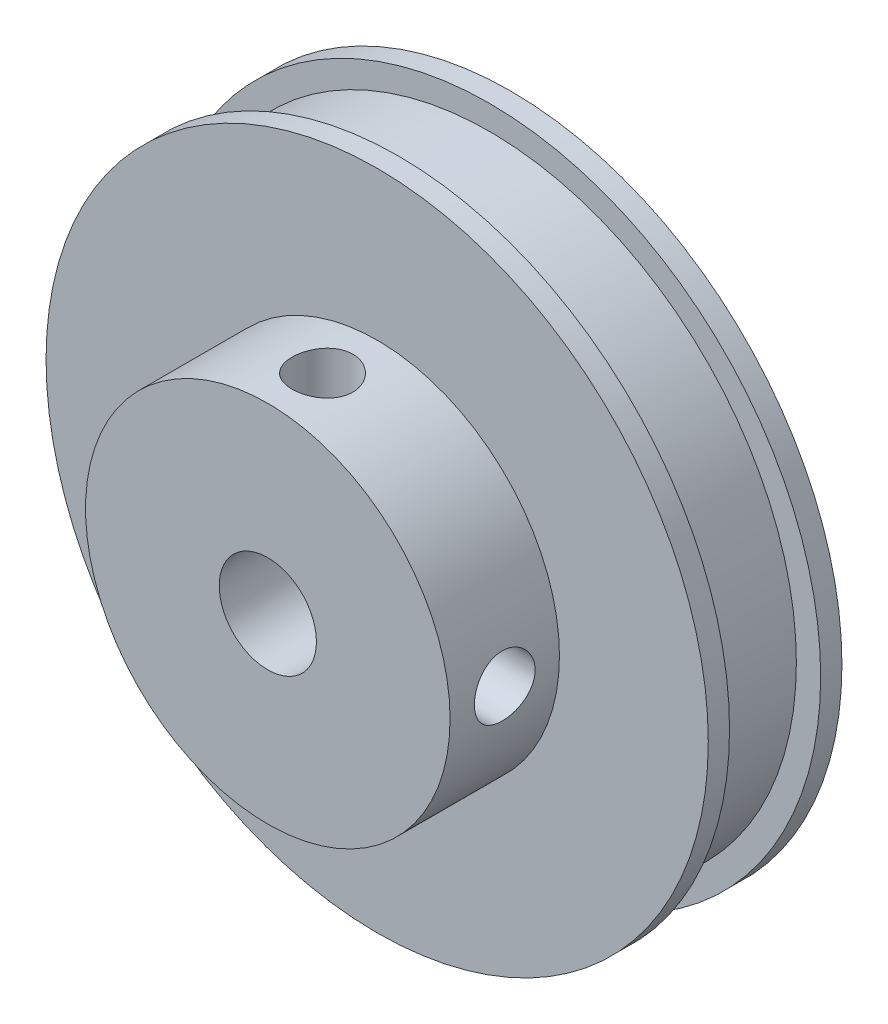
ISO-10303-21;
HEADER;
FILE_DESCRIPTION(('STEP AP214'),'2;1');
FILE_NAME('part.step','',(''),(''),'','','');
FILE_SCHEMA(('AUTOMOTIVE_DESIGN { 1 0 10303 214 1 1 1 1 }'));
ENDSEC;
DATA;
#1=APPLICATION_CONTEXT('core data for automotive mechanical design processes');
#2=APPLICATION_PROTOCOL_DEFINITION('international standard','automotive_design',2000,#1);
#3=PRODUCT_CONTEXT('',#1,'mechanical');
#4=PRODUCT('Part','Part','',(#3));
#5=PRODUCT_RELATED_PRODUCT_CATEGORY('part','',(#4));
#6=PRODUCT_DEFINITION_FORMATION('','',#4);
#7=PRODUCT_DEFINITION_CONTEXT('part definition',#1,'design');
#8=PRODUCT_DEFINITION('design','',#6,#7);
#9=PRODUCT_DEFINITION_SHAPE('','',#8);
#10=(LENGTH_UNIT() NAMED_UNIT(*) SI_UNIT(.MILLI.,.METRE.));
#11=(NAMED_UNIT(*) PLANE_ANGLE_UNIT() SI_UNIT($,.RADIAN.));
#12=(NAMED_UNIT(*) SI_UNIT($,.STERADIAN.) SOLID_ANGLE_UNIT());
#13=UNCERTAINTY_MEASURE_WITH_UNIT(LENGTH_MEASURE(1.E-05),#10,'distance_accuracy_value','');
#14=(GEOMETRIC_REPRESENTATION_CONTEXT(3) GLOBAL_UNCERTAINTY_ASSIGNED_CONTEXT((#13)) GLOBAL_UNIT_ASSIGNED_CONTEXT((#10,
#11,#12)) REPRESENTATION_CONTEXT('',''));
#15=CARTESIAN_POINT('',(0.,0.,0.));
#16=DIRECTION('',(0.,0.,1.));
#17=DIRECTION('',(1.,0.,0.));
#18=AXIS2_PLACEMENT_3D('',#15,#16,#17);
#19=CARTESIAN_POINT('',(0.,0.,1.75));
#20=DIRECTION('',(0.,0.,-1.));
#21=DIRECTION('',(-1.,0.,0.));
#22=AXIS2_PLACEMENT_3D('',#19,#20,#21);
#23=CYLINDRICAL_SURFACE('',#22,27.25);
#24=CARTESIAN_POINT('',(0.,0.,1.75));
#25=DIRECTION('',(0.,0.,1.));
#26=DIRECTION('',(1.,0.,0.));
#27=AXIS2_PLACEMENT_3D('',#24,#25,#26);
#28=CIRCLE('',#27,27.25);
#29=CARTESIAN_POINT('',(27.25,0.,1.75));
#30=VERTEX_POINT('',#29);
#31=EDGE_CURVE('E51',#30,#30,#28,.T.);
#32=ORIENTED_EDGE('',*,*,#31,.F.);
#33=EDGE_LOOP('',(#32));
#34=FACE_BOUND('',#33,.T.);
#35=CARTESIAN_POINT('',(0.,0.,0.));
#36=DIRECTION('',(0.,0.,1.));
#37=DIRECTION('',(1.,0.,0.));
#38=AXIS2_PLACEMENT_3D('',#35,#36,#37);
#39=CIRCLE('',#38,27.25);
#40=CARTESIAN_POINT('',(27.25,0.,0.));
#41=VERTEX_POINT('',#40);
#42=EDGE_CURVE('E65',#41,#41,#39,.T.);
#43=ORIENTED_EDGE('',*,*,#42,.T.);
#44=EDGE_LOOP('',(#43));
#45=FACE_BOUND('',#44,.T.);
#46=ADVANCED_FACE('F34',(#34,#45),#23,.T.);
#47=CARTESIAN_POINT('',(0.,0.,1.75));
#48=DIRECTION('',(0.,0.,1.));
#49=DIRECTION('',(1.,0.,0.));
#50=AXIS2_PLACEMENT_3D('',#47,#48,#49);
#51=PLANE('',#50);
#52=CARTESIAN_POINT('',(0.,0.,1.75));
#53=DIRECTION('',(0.,0.,1.));
#54=DIRECTION('',(1.,0.,0.));
#55=AXIS2_PLACEMENT_3D('',#52,#53,#54);
#56=CIRCLE('',#55,25.25);
#57=CARTESIAN_POINT('',(25.25,0.,1.75));
#58=VERTEX_POINT('',#57);
#59=EDGE_CURVE('E46',#58,#58,#56,.T.);
#60=ORIENTED_EDGE('',*,*,#59,.F.);
#61=EDGE_LOOP('',(#60));
#62=FACE_BOUND('',#61,.T.);
#63=ORIENTED_EDGE('',*,*,#31,.T.);
#64=EDGE_LOOP('',(#63));
#65=FACE_BOUND('',#64,.T.);
#66=ADVANCED_FACE('F129',(#62,#65),#51,.T.);
#67=CARTESIAN_POINT('',(0.,0.,0.));
#68=DIRECTION('',(0.,0.,1.));
#69=DIRECTION('',(1.,0.,0.));
#70=AXIS2_PLACEMENT_3D('',#67,#68,#69);
#71=PLANE('',#70);
#72=CARTESIAN_POINT('',(0.,0.,0.));
#73=DIRECTION('',(0.,0.,1.));
#74=DIRECTION('',(1.,0.,0.));
#75=AXIS2_PLACEMENT_3D('',#72,#73,#74);
#76=CIRCLE('',#75,4.);
#77=CARTESIAN_POINT('',(4.,0.,0.));
#78=VERTEX_POINT('',#77);
#79=EDGE_CURVE('E103',#78,#78,#76,.F.);
#80=ORIENTED_EDGE('',*,*,#79,.F.);
#81=EDGE_LOOP('',(#80));
#82=FACE_BOUND('',#81,.T.);
#83=ORIENTED_EDGE('',*,*,#42,.F.);
#84=EDGE_LOOP('',(#83));
#85=FACE_BOUND('',#84,.T.);
#86=ADVANCED_FACE('F134',(#82,#85),#71,.F.);
#87=CARTESIAN_POINT('',(0.,0.,9.25));
#88=DIRECTION('',(0.,0.,-1.));
#89=DIRECTION('',(-1.,0.,0.));
#90=AXIS2_PLACEMENT_3D('',#87,#88,#89);
#91=CYLINDRICAL_SURFACE('',#90,25.25);
#92=CARTESIAN_POINT('',(0.,0.,9.25));
#93=DIRECTION('',(0.,0.,1.));
#94=DIRECTION('',(1.,0.,0.));
#95=AXIS2_PLACEMENT_3D('',#92,#93,#94);
#96=CIRCLE('',#95,25.25);
#97=CARTESIAN_POINT('',(25.25,0.,9.25));
#98=VERTEX_POINT('',#97);
#99=EDGE_CURVE('E60',#98,#98,#96,.T.);
#100=ORIENTED_EDGE('',*,*,#99,.F.);
#101=EDGE_LOOP('',(#100));
#102=FACE_BOUND('',#101,.T.);
#103=ORIENTED_EDGE('',*,*,#59,.T.);
#104=EDGE_LOOP('',(#103));
#105=FACE_BOUND('',#104,.T.);
#106=ADVANCED_FACE('F142',(#102,#105),#91,.T.);
#107=CARTESIAN_POINT('',(0.,0.,11.));
#108=DIRECTION('',(0.,0.,-1.));
#109=DIRECTION('',(-1.,0.,0.));
#110=AXIS2_PLACEMENT_3D('',#107,#108,#109);
#111=CYLINDRICAL_SURFACE('',#110,27.25);
#112=CARTESIAN_POINT('',(0.,0.,11.));
#113=DIRECTION('',(0.,0.,1.));
#114=DIRECTION('',(1.,0.,0.));
#115=AXIS2_PLACEMENT_3D('',#112,#113,#114);
#116=CIRCLE('',#115,27.25);
#117=CARTESIAN_POINT('',(27.25,0.,11.));
#118=VERTEX_POINT('',#117);
#119=EDGE_CURVE('E57',#118,#118,#116,.T.);
#120=ORIENTED_EDGE('',*,*,#119,.F.);
#121=EDGE_LOOP('',(#120));
#122=FACE_BOUND('',#121,.T.);
#123=CARTESIAN_POINT('',(0.,0.,9.25));
#124=DIRECTION('',(0.,0.,1.));
#125=DIRECTION('',(1.,0.,0.));
#126=AXIS2_PLACEMENT_3D('',#123,#124,#125);
#127=CIRCLE('',#126,27.25);
#128=CARTESIAN_POINT('',(27.25,0.,9.25));
#129=VERTEX_POINT('',#128);
#130=EDGE_CURVE('E61',#129,#129,#127,.T.);
#131=ORIENTED_EDGE('',*,*,#130,.T.);
#132=EDGE_LOOP('',(#131));
#133=FACE_BOUND('',#132,.T.);
#134=ADVANCED_FACE('F147',(#122,#133),#111,.T.);
#135=CARTESIAN_POINT('',(0.,0.,11.));
#136=DIRECTION('',(0.,0.,1.));
#137=DIRECTION('',(1.,0.,0.));
#138=AXIS2_PLACEMENT_3D('',#135,#136,#137);
#139=PLANE('',#138);
#140=CARTESIAN_POINT('',(0.,0.,11.));
#141=DIRECTION('',(0.,0.,1.));
#142=DIRECTION('',(1.,0.,0.));
#143=AXIS2_PLACEMENT_3D('',#140,#141,#142);
#144=CIRCLE('',#143,15.);
#145=CARTESIAN_POINT('',(15.,0.,11.));
#146=VERTEX_POINT('',#145);
#147=EDGE_CURVE('E10',#146,#146,#144,.T.);
#148=ORIENTED_EDGE('',*,*,#147,.F.);
#149=EDGE_LOOP('',(#148));
#150=FACE_BOUND('',#149,.T.);
#151=ORIENTED_EDGE('',*,*,#119,.T.);
#152=EDGE_LOOP('',(#151));
#153=FACE_BOUND('',#152,.T.);
#154=ADVANCED_FACE('F122',(#150,#153),#139,.T.);
#155=CARTESIAN_POINT('',(0.,0.,9.25));
#156=DIRECTION('',(0.,0.,1.));
#157=DIRECTION('',(1.,0.,0.));
#158=AXIS2_PLACEMENT_3D('',#155,#156,#157);
#159=PLANE('',#158);
#160=ORIENTED_EDGE('',*,*,#99,.T.);
#161=EDGE_LOOP('',(#160));
#162=FACE_BOUND('',#161,.T.);
#163=ORIENTED_EDGE('',*,*,#130,.F.);
#164=EDGE_LOOP('',(#163));
#165=FACE_BOUND('',#164,.T.);
#166=ADVANCED_FACE('F114',(#162,#165),#159,.F.);
#167=CARTESIAN_POINT('',(0.,0.,20.));
#168=DIRECTION('',(0.,0.,-1.));
#169=DIRECTION('',(-1.,0.,0.));
#170=AXIS2_PLACEMENT_3D('',#167,#168,#169);
#171=CYLINDRICAL_SURFACE('',#170,15.);
#172=CARTESIAN_POINT('',(0.,15.,13.));
#173=CARTESIAN_POINT('',(-0.139390904958215,14.9999976116882,13.0000055889478));
#174=CARTESIAN_POINT('',(-0.278857881838821,14.9980367791303,13.0116972749689));
#175=CARTESIAN_POINT('',(-0.553880221673042,14.9904034494139,13.0581356587653));
#176=CARTESIAN_POINT('',(-0.689431867959246,14.9847275392389,13.0929035569116));
#177=CARTESIAN_POINT('',(-0.952604747212643,14.9703006823645,13.1844154485928));
#178=CARTESIAN_POINT('',(-1.0802323684319,14.9615522515919,13.2411414656406));
#179=CARTESIAN_POINT('',(-1.32414184197794,14.9419422708207,13.3749122920524));
#180=CARTESIAN_POINT('',(-1.44042498987859,14.9310809625443,13.451954777483));
#181=CARTESIAN_POINT('',(-1.65947261429168,14.9083331745831,13.6249550838205));
#182=CARTESIAN_POINT('',(-1.76211290353497,14.8964387181486,13.7210691146361));
#183=CARTESIAN_POINT('',(-1.94988849865993,14.8730262687673,13.9291479684728));
#184=CARTESIAN_POINT('',(-2.03502269939097,14.8615082996267,14.0411137914566));
#185=CARTESIAN_POINT('',(-2.18586712560513,14.8400756575978,14.2785709661971));
#186=CARTESIAN_POINT('',(-2.251454552861,14.8301712909164,14.4041413368048));
#187=CARTESIAN_POINT('',(-2.36055836541122,14.8131978979467,14.6647095643006));
#188=CARTESIAN_POINT('',(-2.40407624156561,14.8061286801431,14.7997067836776));
#189=CARTESIAN_POINT('',(-2.46741437778481,14.7957053684276,15.0739802748565));
#190=CARTESIAN_POINT('',(-2.4874490291354,14.792317684857,15.2132057365014));
#191=CARTESIAN_POINT('',(-2.50391672528987,14.7895393893665,15.4930802768835));
#192=CARTESIAN_POINT('',(-2.500351440389,14.7901484945721,15.6337292541673));
#193=CARTESIAN_POINT('',(-2.46989509839615,14.7952642886355,15.9109278612754));
#194=CARTESIAN_POINT('',(-2.44324488188977,14.7997307331892,16.0475048035452));
#195=CARTESIAN_POINT('',(-2.36775314040344,14.8119949521101,16.3142213178291));
#196=CARTESIAN_POINT('',(-2.31891085431974,14.8197928407327,16.4443606688885));
#197=CARTESIAN_POINT('',(-2.20017724609391,14.837884793341,16.6952288234409));
#198=CARTESIAN_POINT('',(-2.13018591387971,14.8481906710733,16.8159094060812));
#199=CARTESIAN_POINT('',(-1.97121201755743,14.8701291841501,17.0439044005384));
#200=CARTESIAN_POINT('',(-1.88222792065429,14.8817619265429,17.1512177324549));
#201=CARTESIAN_POINT('',(-1.68648221215905,14.9052202787979,17.3508260858073));
#202=CARTESIAN_POINT('',(-1.57951396387313,14.9170464923165,17.4429185185401));
#203=CARTESIAN_POINT('',(-1.35153524898165,14.9394260139672,17.6078777626653));
#204=CARTESIAN_POINT('',(-1.23052469190642,14.9499793138975,17.6807444501832));
#205=CARTESIAN_POINT('',(-0.977705916166712,14.9686389289291,17.8052022271363));
#206=CARTESIAN_POINT('',(-0.845888725564663,14.9767431840745,17.8567754193313));
#207=CARTESIAN_POINT('',(-0.575298345602733,14.9895750301266,17.936994215246));
#208=CARTESIAN_POINT('',(-0.436525739179469,14.9943029035047,17.9656417369737));
#209=CARTESIAN_POINT('',(-0.157709901301623,14.9998112984269,17.9989213584611));
#210=CARTESIAN_POINT('',(-0.0177007371510108,15.0006375301278,18.0038315718056));
#211=CARTESIAN_POINT('',(0.261139772889887,14.9983747442117,17.9902386555719));
#212=CARTESIAN_POINT('',(0.399971163892038,14.9952858772412,17.9717364268663));
#213=CARTESIAN_POINT('',(0.671656175546762,14.985568269382,17.9120751506645));
#214=CARTESIAN_POINT('',(0.804540868385379,14.9789610480131,17.8710537916099));
#215=CARTESIAN_POINT('',(1.06154688486044,14.9629446445536,17.7676654818005));
#216=CARTESIAN_POINT('',(1.18566771590972,14.9535353051202,17.7052973323647));
#217=CARTESIAN_POINT('',(1.42283068946896,14.9328451630241,17.5603488753032));
#218=CARTESIAN_POINT('',(1.53576525093715,14.9215485588702,17.4775948438327));
#219=CARTESIAN_POINT('',(1.74624358550269,14.898384673919,17.2944626846149));
#220=CARTESIAN_POINT('',(1.84378623969658,14.8865173517155,17.1940832767233));
#221=CARTESIAN_POINT('',(2.021742779658,14.8634017523585,16.9773024519286));
#222=CARTESIAN_POINT('',(2.10196876111371,14.8521611613711,16.8607458344856));
#223=CARTESIAN_POINT('',(2.24170231029498,14.8317152977788,16.6156470308615));
#224=CARTESIAN_POINT('',(2.30121053476982,14.8225099606602,16.4871052247725));
#225=CARTESIAN_POINT('',(2.39753833147315,14.807234536977,16.2222102671879));
#226=CARTESIAN_POINT('',(2.43445143254794,14.8011515431106,16.0858919049695));
#227=CARTESIAN_POINT('',(2.48483545377828,14.7927771683526,15.8088798707782));
#228=CARTESIAN_POINT('',(2.49830841194617,14.7904854578272,15.6681865802679));
#229=CARTESIAN_POINT('',(2.50137286604735,14.7899673308401,15.3882948340376));
#230=CARTESIAN_POINT('',(2.49126013612519,14.7916905650565,15.2490996214247));
#231=CARTESIAN_POINT('',(2.44807983895685,14.7988978145373,14.9744207519492));
#232=CARTESIAN_POINT('',(2.41501234611248,14.8043818176121,14.8389370830581));
#233=CARTESIAN_POINT('',(2.3269744895949,14.8184735628172,14.5756415627074));
#234=CARTESIAN_POINT('',(2.27202959060044,14.8270776721967,14.447820989944));
#235=CARTESIAN_POINT('',(2.14182700391591,14.8464436892221,14.2031643308052));
#236=CARTESIAN_POINT('',(2.06656830874856,14.857205703884,14.0863287896279));
#237=CARTESIAN_POINT('',(1.89681888437215,14.8798345404562,13.8654644168922));
#238=CARTESIAN_POINT('',(1.80211056359365,14.891712955763,13.7616039832997));
#239=CARTESIAN_POINT('',(1.59660903138023,14.9151437236084,13.5711483955251));
#240=CARTESIAN_POINT('',(1.48581211291264,14.9266960002655,13.4845572313618));
#241=CARTESIAN_POINT('',(1.25036916964028,14.9482652964222,13.3305517318001));
#242=CARTESIAN_POINT('',(1.12563278753282,14.958271162531,13.263273960687));
#243=CARTESIAN_POINT('',(0.866513069378982,14.9755116760178,13.1507305153901));
#244=CARTESIAN_POINT('',(0.73213949483001,14.9827490817748,13.1054429189203));
#245=CARTESIAN_POINT('',(0.497703310045401,14.9920579083296,13.0479947258733));
#246=CARTESIAN_POINT('',(0.399058830298448,14.9950202727336,13.030025530384));
#247=CARTESIAN_POINT('',(0.200289310319809,14.9989921598612,13.0060262621552));
#248=CARTESIAN_POINT('',(0.100164295608494,15.0000017162064,12.9999959838626));
#249=CARTESIAN_POINT('',(0.,15.,13.));
#250=B_SPLINE_CURVE_WITH_KNOTS('',3,(#172,#173,#174,#175,#176,#177,#178,#179,#180,#181,#182,
#183,#184,#185,#186,#187,#188,#189,#190,#191,#192,#193,#194,#195,#196,#197,#198,#199,#200,#201,
#202,#203,#204,#205,#206,#207,#208,#209,#210,#211,#212,#213,#214,#215,#216,#217,#218,#219,#220,
#221,#222,#223,#224,#225,#226,#227,#228,#229,#230,#231,#232,#233,#234,#235,#236,#237,#238,#239,
#240,#241,#242,#243,#244,#245,#246,#247,#248,#249),.UNSPECIFIED.,.T.,.F.,(4,2,2,2,2,2,2,2,2,2,2,
2,2,2,2,2,2,2,2,2,2,2,2,2,2,2,2,2,2,2,2,2,2,2,2,2,2,2,4),(0.,0.417806584938509,0.83599754569542,
1.25384686702527,1.67164841267479,2.09302491062332,2.51442800169857,2.9384252082384,
3.36239376876181,3.78246077103423,4.20249804320887,4.61820521760409,5.03392665025381,
5.45164556632557,5.86939820680573,6.29232769911326,6.71525991635847,7.13854688915903,
7.56179844521148,7.98007883491397,8.39834313035859,8.81407807006415,9.22983635826066,
9.64926825627023,10.0687306305428,10.4925382200762,10.9163323737594,11.3383602234177,
11.7603513778662,12.177079095227,12.5938054618813,13.0100481822622,13.4263115502934,
13.8475138419339,14.2688133387897,14.693022316072,15.1168075213007,15.4170424816402,
15.7172722727697),.UNSPECIFIED.);
#251=CARTESIAN_POINT('',(0.,15.,13.));
#252=VERTEX_POINT('',#251);
#253=EDGE_CURVE('E98',#252,#252,#250,.T.);
#254=ORIENTED_EDGE('',*,*,#253,.F.);
#255=EDGE_LOOP('',(#254));
#256=FACE_BOUND('',#255,.T.);
#257=CARTESIAN_POINT('',(15.,0.,18.));
#258=CARTESIAN_POINT('',(14.9999976116882,-0.139390904958215,17.9999944110522));
#259=CARTESIAN_POINT('',(14.9980367791303,-0.278857881838821,17.9883027250311));
#260=CARTESIAN_POINT('',(14.9904034494139,-0.553880221673043,17.9418643412347));
#261=CARTESIAN_POINT('',(14.9847275392389,-0.689431867959247,17.9070964430884));
#262=CARTESIAN_POINT('',(14.9703006823645,-0.952604747212644,17.8155845514072));
#263=CARTESIAN_POINT('',(14.9615522515919,-1.0802323684319,17.7588585343594));
#264=CARTESIAN_POINT('',(14.9419422708207,-1.32414184197794,17.6250877079476));
#265=CARTESIAN_POINT('',(14.9310809625443,-1.44042498987859,17.548045222517));
#266=CARTESIAN_POINT('',(14.9083331745831,-1.65947261429168,17.3750449161795));
#267=CARTESIAN_POINT('',(14.8964387181486,-1.76211290353497,17.2789308853639));
#268=CARTESIAN_POINT('',(14.8730262687673,-1.94988849865993,17.0708520315272));
#269=CARTESIAN_POINT('',(14.8615082996267,-2.03502269939097,16.9588862085434));
#270=CARTESIAN_POINT('',(14.8400756575978,-2.18586712560513,16.7214290338029));
#271=CARTESIAN_POINT('',(14.8301712909164,-2.251454552861,16.5958586631952));
#272=CARTESIAN_POINT('',(14.8131978979467,-2.36055836541122,16.3352904356994));
#273=CARTESIAN_POINT('',(14.8061286801431,-2.40407624156561,16.2002932163224));
#274=CARTESIAN_POINT('',(14.7957053684276,-2.46741437778481,15.9260197251435));
#275=CARTESIAN_POINT('',(14.792317684857,-2.4874490291354,15.7867942634986));
#276=CARTESIAN_POINT('',(14.7895393893665,-2.50391672528987,15.5069197231165));
#277=CARTESIAN_POINT('',(14.7901484945721,-2.500351440389,15.3662707458327));
#278=CARTESIAN_POINT('',(14.7952642886355,-2.46989509839615,15.0890721387245));
#279=CARTESIAN_POINT('',(14.7997307331892,-2.44324488188977,14.9524951964548));
#280=CARTESIAN_POINT('',(14.8119949521101,-2.36775314040344,14.6857786821709));
#281=CARTESIAN_POINT('',(14.8197928407327,-2.31891085431974,14.5556393311114));
#282=CARTESIAN_POINT('',(14.837884793341,-2.20017724609391,14.3047711765591));
#283=CARTESIAN_POINT('',(14.8481906710733,-2.13018591387971,14.1840905939188));
#284=CARTESIAN_POINT('',(14.8701291841501,-1.97121201755743,13.9560955994616));
#285=CARTESIAN_POINT('',(14.8817619265429,-1.88222792065429,13.8487822675451));
#286=CARTESIAN_POINT('',(14.9052202787979,-1.68648221215905,13.6491739141927));
#287=CARTESIAN_POINT('',(14.9170464923165,-1.57951396387313,13.5570814814599));
#288=CARTESIAN_POINT('',(14.9394260139672,-1.35153524898165,13.3921222373347));
#289=CARTESIAN_POINT('',(14.9499793138975,-1.23052469190642,13.3192555498168));
#290=CARTESIAN_POINT('',(14.9686389289291,-0.977705916166711,13.1947977728637));
#291=CARTESIAN_POINT('',(14.9767431840745,-0.845888725564661,13.1432245806687));
#292=CARTESIAN_POINT('',(14.9895750301266,-0.575298345602731,13.063005784754));
#293=CARTESIAN_POINT('',(14.9943029035047,-0.436525739179468,13.0343582630263));
#294=CARTESIAN_POINT('',(14.9998112984269,-0.157709901301624,13.0010786415389));
#295=CARTESIAN_POINT('',(15.0006375301278,-0.017700737151011,12.9961684281944));
#296=CARTESIAN_POINT('',(14.9983747442117,0.261139772889887,13.0097613444281));
#297=CARTESIAN_POINT('',(14.9952858772412,0.399971163892038,13.0282635731337));
#298=CARTESIAN_POINT('',(14.985568269382,0.671656175546762,13.0879248493355));
#299=CARTESIAN_POINT('',(14.9789610480131,0.804540868385378,13.1289462083901));
#300=CARTESIAN_POINT('',(14.9629446445536,1.06154688486044,13.2323345181995));
#301=CARTESIAN_POINT('',(14.9535353051202,1.18566771590972,13.2947026676353));
#302=CARTESIAN_POINT('',(14.9328451630241,1.42283068946896,13.4396511246968));
#303=CARTESIAN_POINT('',(14.9215485588702,1.53576525093715,13.5224051561673));
#304=CARTESIAN_POINT('',(14.898384673919,1.74624358550269,13.7055373153851));
#305=CARTESIAN_POINT('',(14.8865173517155,1.84378623969658,13.8059167232767));
#306=CARTESIAN_POINT('',(14.8634017523585,2.021742779658,14.0226975480714));
#307=CARTESIAN_POINT('',(14.8521611613711,2.10196876111371,14.1392541655144));
#308=CARTESIAN_POINT('',(14.8317152977788,2.24170231029498,14.3843529691385));
#309=CARTESIAN_POINT('',(14.8225099606602,2.30121053476982,14.5128947752275));
#310=CARTESIAN_POINT('',(14.807234536977,2.39753833147315,14.7777897328121));
#311=CARTESIAN_POINT('',(14.8011515431106,2.43445143254794,14.9141080950305));
#312=CARTESIAN_POINT('',(14.7927771683526,2.48483545377828,15.1911201292218));
#313=CARTESIAN_POINT('',(14.7904854578272,2.49830841194617,15.331813419732));
#314=CARTESIAN_POINT('',(14.7899673308401,2.50137286604735,15.6117051659624));
#315=CARTESIAN_POINT('',(14.7916905650565,2.49126013612519,15.7509003785753));
#316=CARTESIAN_POINT('',(14.7988978145373,2.44807983895685,16.0255792480508));
#317=CARTESIAN_POINT('',(14.8043818176121,2.41501234611248,16.1610629169419));
#318=CARTESIAN_POINT('',(14.8184735628172,2.3269744895949,16.4243584372926));
#319=CARTESIAN_POINT('',(14.8270776721967,2.27202959060044,16.552179010056));
#320=CARTESIAN_POINT('',(14.8464436892221,2.14182700391591,16.7968356691948));
#321=CARTESIAN_POINT('',(14.857205703884,2.06656830874856,16.9136712103721));
#322=CARTESIAN_POINT('',(14.8798345404562,1.89681888437216,17.1345355831077));
#323=CARTESIAN_POINT('',(14.891712955763,1.80211056359365,17.2383960167003));
#324=CARTESIAN_POINT('',(14.9151437236084,1.59660903138023,17.4288516044749));
#325=CARTESIAN_POINT('',(14.9266960002655,1.48581211291264,17.5154427686382));
#326=CARTESIAN_POINT('',(14.9482652964222,1.25036916964028,17.6694482681999));
#327=CARTESIAN_POINT('',(14.958271162531,1.12563278753282,17.7367260393129));
#328=CARTESIAN_POINT('',(14.9755116760178,0.866513069378982,17.8492694846099));
#329=CARTESIAN_POINT('',(14.9827490817748,0.732139494830011,17.8945570810797));
#330=CARTESIAN_POINT('',(14.9920579083296,0.497703310045402,17.9520052741267));
#331=CARTESIAN_POINT('',(14.9950202727336,0.399058830298448,17.969974469616));
#332=CARTESIAN_POINT('',(14.9989921598612,0.20028931031981,17.9939737378448));
#333=CARTESIAN_POINT('',(15.0000017162064,0.100164295608494,18.0000040161374));
#334=CARTESIAN_POINT('',(15.,0.,18.));
#335=B_SPLINE_CURVE_WITH_KNOTS('',3,(#257,#258,#259,#260,#261,#262,#263,#264,#265,#266,#267,
#268,#269,#270,#271,#272,#273,#274,#275,#276,#277,#278,#279,#280,#281,#282,#283,#284,#285,#286,
#287,#288,#289,#290,#291,#292,#293,#294,#295,#296,#297,#298,#299,#300,#301,#302,#303,#304,#305,
#306,#307,#308,#309,#310,#311,#312,#313,#314,#315,#316,#317,#318,#319,#320,#321,#322,#323,#324,
#325,#326,#327,#328,#329,#330,#331,#332,#333,#334),.UNSPECIFIED.,.T.,.F.,(4,2,2,2,2,2,2,2,2,2,2,
2,2,2,2,2,2,2,2,2,2,2,2,2,2,2,2,2,2,2,2,2,2,2,2,2,2,2,4),(0.,0.417806584938509,0.83599754569542,
1.25384686702527,1.67164841267479,2.09302491062332,2.51442800169857,2.9384252082384,
3.36239376876181,3.78246077103424,4.20249804320886,4.61820521760409,5.03392665025381,
5.45164556632557,5.86939820680573,6.29232769911326,6.71525991635847,7.13854688915903,
7.56179844521149,7.98007883491397,8.39834313035859,8.81407807006415,9.22983635826066,
9.64926825627023,10.0687306305428,10.4925382200762,10.9163323737594,11.3383602234177,
11.7603513778662,12.177079095227,12.5938054618813,13.0100481822622,13.4263115502934,
13.8475138419339,14.2688133387897,14.693022316072,15.1168075213007,15.4170424816402,
15.7172722727697),.UNSPECIFIED.);
#336=CARTESIAN_POINT('',(15.,0.,18.));
#337=VERTEX_POINT('',#336);
#338=EDGE_CURVE('E77',#337,#337,#335,.T.);
#339=ORIENTED_EDGE('',*,*,#338,.F.);
#340=EDGE_LOOP('',(#339));
#341=FACE_BOUND('',#340,.T.);
#342=CARTESIAN_POINT('',(0.,0.,20.));
#343=DIRECTION('',(0.,0.,1.));
#344=DIRECTION('',(1.,0.,0.));
#345=AXIS2_PLACEMENT_3D('',#342,#343,#344);
#346=CIRCLE('',#345,15.);
#347=CARTESIAN_POINT('',(15.,0.,20.));
#348=VERTEX_POINT('',#347);
#349=EDGE_CURVE('E55',#348,#348,#346,.T.);
#350=ORIENTED_EDGE('',*,*,#349,.F.);
#351=EDGE_LOOP('',(#350));
#352=FACE_BOUND('',#351,.T.);
#353=ORIENTED_EDGE('',*,*,#147,.T.);
#354=EDGE_LOOP('',(#353));
#355=FACE_BOUND('',#354,.T.);
#356=ADVANCED_FACE('F112',(#256,#341,#352,#355),#171,.T.);
#357=CARTESIAN_POINT('',(0.,0.,20.));
#358=DIRECTION('',(0.,0.,1.));
#359=DIRECTION('',(1.,0.,0.));
#360=AXIS2_PLACEMENT_3D('',#357,#358,#359);
#361=PLANE('',#360);
#362=CARTESIAN_POINT('',(0.,0.,20.));
#363=DIRECTION('',(0.,0.,1.));
#364=DIRECTION('',(1.,0.,0.));
#365=AXIS2_PLACEMENT_3D('',#362,#363,#364);
#366=CIRCLE('',#365,4.);
#367=CARTESIAN_POINT('',(4.,0.,20.));
#368=VERTEX_POINT('',#367);
#369=EDGE_CURVE('E76',#368,#368,#366,.T.);
#370=ORIENTED_EDGE('',*,*,#369,.F.);
#371=EDGE_LOOP('',(#370));
#372=FACE_BOUND('',#371,.T.);
#373=ORIENTED_EDGE('',*,*,#349,.T.);
#374=EDGE_LOOP('',(#373));
#375=FACE_BOUND('',#374,.T.);
#376=ADVANCED_FACE('F110',(#372,#375),#361,.T.);
#377=CARTESIAN_POINT('',(0.,0.,-11.3137084989848));
#378=DIRECTION('',(0.,0.,1.));
#379=DIRECTION('',(1.,0.,0.));
#380=AXIS2_PLACEMENT_3D('',#377,#378,#379);
#381=CYLINDRICAL_SURFACE('',#380,4.);
#382=CARTESIAN_POINT('',(0.,4.,13.));
#383=CARTESIAN_POINT('',(-0.127017476559871,3.99999041333571,13.0000104761436));
#384=CARTESIAN_POINT('',(-0.254191951791703,3.9938860659399,13.0097464999017));
#385=CARTESIAN_POINT('',(-0.504637456621344,3.97004375552586,13.0481711296843));
#386=CARTESIAN_POINT('',(-0.627900575825985,3.95228361873137,13.0768958602612));
#387=CARTESIAN_POINT('',(-0.866410868269161,3.90691695293563,13.1516228532875));
#388=CARTESIAN_POINT('',(-0.981694420709429,3.87935918690877,13.1975396097876));
#389=CARTESIAN_POINT('',(-1.20252080434994,3.81669199838277,13.3047716674915));
#390=CARTESIAN_POINT('',(-1.30806471304098,3.7815834126609,13.3660852625531));
#391=CARTESIAN_POINT('',(-1.51594836437078,3.70340304945467,13.5077731565911));
#392=CARTESIAN_POINT('',(-1.61735911616791,3.65991924217889,13.5892786027018));
#393=CARTESIAN_POINT('',(-1.80597275567284,3.57062700058922,13.7664383462585));
#394=CARTESIAN_POINT('',(-1.89315621594404,3.52481549782957,13.8621116557389));
#395=CARTESIAN_POINT('',(-2.06285746302521,3.42860837235627,14.0800677892912));
#396=CARTESIAN_POINT('',(-2.14314412018317,3.37843221966147,14.2041995734309));
#397=CARTESIAN_POINT('',(-2.28147932079995,3.28660396278105,14.4671296306783));
#398=CARTESIAN_POINT('',(-2.33956541787438,3.2449375200046,14.605902625168));
#399=CARTESIAN_POINT('',(-2.41866801180576,3.18619151248815,14.8576210475457));
#400=CARTESIAN_POINT('',(-2.44539104794679,3.16553811970886,14.9679336369183));
#401=CARTESIAN_POINT('',(-2.4836368711914,3.1356271466086,15.1926118513807));
#402=CARTESIAN_POINT('',(-2.49518112485637,3.12635347378457,15.3069715171732));
#403=CARTESIAN_POINT('',(-2.50237836690497,3.12059771534501,15.5368260328764));
#404=CARTESIAN_POINT('',(-2.49798968200884,3.12414917427958,15.652323070578));
#405=CARTESIAN_POINT('',(-2.47352633347829,3.14354804883411,15.8806202087266));
#406=CARTESIAN_POINT('',(-2.45343909745149,3.15940531965489,15.9934180728499));
#407=CARTESIAN_POINT('',(-2.3993620946426,3.20065145822146,16.2108768967436));
#408=CARTESIAN_POINT('',(-2.36570043522604,3.22581428653571,16.3156648797174));
#409=CARTESIAN_POINT('',(-2.28580369589507,3.28291134443418,16.5183223964732));
#410=CARTESIAN_POINT('',(-2.2395641689404,3.31484796808523,16.6161894678435));
#411=CARTESIAN_POINT('',(-2.12589830407261,3.38909625095658,16.8216664075102));
#412=CARTESIAN_POINT('',(-2.05612773657747,3.4322315520855,16.9276810518524));
#413=CARTESIAN_POINT('',(-1.90176111958637,3.52011451554715,17.1276611269764));
#414=CARTESIAN_POINT('',(-1.81714983251341,3.56486379714022,17.2216140000451));
#415=CARTESIAN_POINT('',(-1.61904732877734,3.65959667460597,17.4106010095826));
#416=CARTESIAN_POINT('',(-1.50309447420017,3.70922571443728,17.5032559427216));
#417=CARTESIAN_POINT('',(-1.25426444468514,3.8005660184067,17.667711793631));
#418=CARTESIAN_POINT('',(-1.12139395127005,3.84228039228673,17.7395209078095));
#419=CARTESIAN_POINT('',(-0.915775751567442,3.89435975869902,17.827345956635));
#420=CARTESIAN_POINT('',(-0.848193583187393,3.90966874385268,17.8528342864304));
#421=CARTESIAN_POINT('',(-0.710492049478446,3.93701839875445,17.8980076504786));
#422=CARTESIAN_POINT('',(-0.6403741759679,3.94906095588034,17.9176960365708));
#423=CARTESIAN_POINT('',(-0.498239019538473,3.96949699527849,17.9509341616424));
#424=CARTESIAN_POINT('',(-0.426223500915277,3.97789374843884,17.964489403526));
#425=CARTESIAN_POINT('',(-0.280965673560734,3.99078766491331,17.9852462933136));
#426=CARTESIAN_POINT('',(-0.207723576570753,3.99528549435853,17.9924490265473));
#427=CARTESIAN_POINT('',(-0.00911917689680767,4.00193773474167,18.0031093046435));
#428=CARTESIAN_POINT('',(0.116782016705693,4.000238122366,18.0004003631235));
#429=CARTESIAN_POINT('',(0.365967766011664,3.98518313408306,17.9762403355345));
#430=CARTESIAN_POINT('',(0.489252499359947,3.97182855210102,17.9547905260753));
#431=CARTESIAN_POINT('',(0.725036194002598,3.93547975555369,17.8955214120172));
#432=CARTESIAN_POINT('',(0.837768421062909,3.91288306371127,17.8583752792302));
#433=CARTESIAN_POINT('',(1.05527816125331,3.85991402897874,17.7694076286876));
#434=CARTESIAN_POINT('',(1.16005433861599,3.82954038411642,17.7175836534986));
#435=CARTESIAN_POINT('',(1.37016761969194,3.75980014020658,17.5949694624922));
#436=CARTESIAN_POINT('',(1.47449380296905,3.71983526755373,17.522792827725));
#437=CARTESIAN_POINT('',(1.67028541330073,3.63613942885727,17.3644123035307));
#438=CARTESIAN_POINT('',(1.76173634038025,3.59240430473134,17.2781928311143));
#439=CARTESIAN_POINT('',(1.94294835276253,3.49811738486729,17.0797299101543));
#440=CARTESIAN_POINT('',(2.03053702733637,3.44749766579192,16.9655255845025));
#441=CARTESIAN_POINT('',(2.18560704916439,3.35133525746893,16.7222484330174));
#442=CARTESIAN_POINT('',(2.25310231693768,3.3057890670837,16.5931859871087));
#443=CARTESIAN_POINT('',(2.35369543821018,3.2346706057884,16.3506157034004));
#444=CARTESIAN_POINT('',(2.39103791720685,3.20691272363805,16.2395184986113));
#445=CARTESIAN_POINT('',(2.45000216420747,3.16210061351252,16.0112137083865));
#446=CARTESIAN_POINT('',(2.47164849805251,3.1450296652982,15.8940159803106));
#447=CARTESIAN_POINT('',(2.49802767469226,3.12412649932601,15.6558194470296));
#448=CARTESIAN_POINT('',(2.50266374586469,3.12037003193165,15.5348028321201));
#449=CARTESIAN_POINT('',(2.49439556773531,3.12698126375719,15.2937380761705));
#450=CARTESIAN_POINT('',(2.48148548821457,3.13735365770479,15.1736902703806));
#451=CARTESIAN_POINT('',(2.44076547086104,3.16910777009989,14.9479404205639));
#452=CARTESIAN_POINT('',(2.41423847191721,3.18953614189074,14.8418614354976));
#453=CARTESIAN_POINT('',(2.34835238743426,3.23835062785226,14.6357298424817));
#454=CARTESIAN_POINT('',(2.30898795090781,3.26674005971309,14.5356797681827));
#455=CARTESIAN_POINT('',(2.21205415803959,3.33327797617852,14.3288066756619));
#456=CARTESIAN_POINT('',(2.15267427981667,3.3722442852408,14.2231000537363));
#457=CARTESIAN_POINT('',(2.01999894889208,3.45335445323995,14.0221226142907));
#458=CARTESIAN_POINT('',(1.94669224594686,3.49550086438999,13.9268603326259));
#459=CARTESIAN_POINT('',(1.77134669685941,3.58803675426846,13.7299744162016));
#460=CARTESIAN_POINT('',(1.66649284489893,3.63840488260278,13.6308302384607));
#461=CARTESIAN_POINT('',(1.43961937990849,3.7339805383823,13.4509984038749));
#462=CARTESIAN_POINT('',(1.3175892119665,3.77918486147258,13.3703221763225));
#463=CARTESIAN_POINT('',(1.12346357942551,3.83959214728415,13.2654365614412));
#464=CARTESIAN_POINT('',(1.05679601158095,3.85851834157057,13.233125199953));
#465=CARTESIAN_POINT('',(0.920199584374066,3.89335165397882,13.1743277481762));
#466=CARTESIAN_POINT('',(0.850272633931988,3.9092605122592,13.1478382988649));
#467=CARTESIAN_POINT('',(0.70787368843777,3.93753374175517,13.1011428555378));
#468=CARTESIAN_POINT('',(0.635409144572269,3.94990764965183,13.0809199427543));
#469=CARTESIAN_POINT('',(0.488456989557119,3.97075677458059,13.0470245444176));
#470=CARTESIAN_POINT('',(0.413970913545531,3.97923486692924,13.0333472275605));
#471=CARTESIAN_POINT('',(0.282852605094053,3.99038271291772,13.0154095897733));
#472=CARTESIAN_POINT('',(0.226501515914872,3.99398159517595,13.0096384697478));
#473=CARTESIAN_POINT('',(0.113444074519048,3.99879245372932,13.0019312163728));
#474=CARTESIAN_POINT('',(0.0567377005313063,4.00000428228699,12.9999953203896));
#475=CARTESIAN_POINT('',(0.,4.,13.));
#476=B_SPLINE_CURVE_WITH_KNOTS('',3,(#382,#383,#384,#385,#386,#387,#388,#389,#390,#391,#392,
#393,#394,#395,#396,#397,#398,#399,#400,#401,#402,#403,#404,#405,#406,#407,#408,#409,#410,#411,
#412,#413,#414,#415,#416,#417,#418,#419,#420,#421,#422,#423,#424,#425,#426,#427,#428,#429,#430,
#431,#432,#433,#434,#435,#436,#437,#438,#439,#440,#441,#442,#443,#444,#445,#446,#447,#448,#449,
#450,#451,#452,#453,#454,#455,#456,#457,#458,#459,#460,#461,#462,#463,#464,#465,#466,#467,#468,
#469,#470,#471,#472,#473,#474,#475),.UNSPECIFIED.,.T.,.F.,(4,2,2,2,2,2,2,2,2,2,2,2,2,2,2,2,2,2,
2,2,2,2,2,2,2,2,2,2,2,2,2,2,2,2,2,2,2,2,2,2,2,2,2,2,2,2,4),(0.,0.380824602868265,
0.762375788256923,1.14205397519027,1.52169010807759,1.93164374107244,2.34215256651403,
2.80825951705946,3.27357449214021,3.61824017759434,3.96241789414781,4.30749646997556,
4.65285169010166,4.99031678920873,5.32790135816065,5.72854900708719,6.12961045150363,
6.59684361399043,7.06389281455722,7.28510978359955,7.50619865744382,7.72708876613707,
7.94794112831293,8.32363778110177,8.69930884379593,9.06028425977628,9.42132014771964,
9.81879878896137,10.216721545704,10.6724083464246,11.1277787130885,11.4876929754247,
11.8470427174174,12.2084336629143,12.5699447204276,12.9023575499051,13.2349091154192,
13.6156046298899,13.9966089922257,14.4531049498525,14.9098826607203,15.138984863948,
15.3679545348469,15.5963005225022,15.8244777070605,15.994578512822,16.1646898459841),.UNSPECIFIED.);
#477=CARTESIAN_POINT('',(0.,4.,13.));
#478=VERTEX_POINT('',#477);
#479=EDGE_CURVE('E37',#478,#478,#476,.T.);
#480=ORIENTED_EDGE('',*,*,#479,.T.);
#481=EDGE_LOOP('',(#480));
#482=FACE_BOUND('',#481,.T.);
#483=CARTESIAN_POINT('',(4.,0.,13.));
#484=CARTESIAN_POINT('',(3.99999041333571,0.127017476559871,13.0000104761436));
#485=CARTESIAN_POINT('',(3.9938860659399,0.254191951791703,13.0097464999017));
#486=CARTESIAN_POINT('',(3.97004375552586,0.504637456621344,13.0481711296843));
#487=CARTESIAN_POINT('',(3.95228361873137,0.627900575825985,13.0768958602612));
#488=CARTESIAN_POINT('',(3.90691695293563,0.866410868269161,13.1516228532875));
#489=CARTESIAN_POINT('',(3.87935918690877,0.981694420709429,13.1975396097876));
#490=CARTESIAN_POINT('',(3.81669199838277,1.20252080434994,13.3047716674915));
#491=CARTESIAN_POINT('',(3.7815834126609,1.30806471304098,13.3660852625531));
#492=CARTESIAN_POINT('',(3.70340304945467,1.51594836437078,13.5077731565911));
#493=CARTESIAN_POINT('',(3.65991924217889,1.61735911616791,13.5892786027018));
#494=CARTESIAN_POINT('',(3.57062700058922,1.80597275567284,13.7664383462585));
#495=CARTESIAN_POINT('',(3.52481549782957,1.89315621594404,13.8621116557389));
#496=CARTESIAN_POINT('',(3.42860837235627,2.06285746302521,14.0800677892912));
#497=CARTESIAN_POINT('',(3.37843221966147,2.14314412018317,14.2041995734309));
#498=CARTESIAN_POINT('',(3.28660396278105,2.28147932079995,14.4671296306783));
#499=CARTESIAN_POINT('',(3.2449375200046,2.33956541787438,14.605902625168));
#500=CARTESIAN_POINT('',(3.18619151248815,2.41866801180576,14.8576210475457));
#501=CARTESIAN_POINT('',(3.16553811970886,2.44539104794679,14.9679336369183));
#502=CARTESIAN_POINT('',(3.1356271466086,2.4836368711914,15.1926118513807));
#503=CARTESIAN_POINT('',(3.12635347378457,2.49518112485637,15.3069715171732));
#504=CARTESIAN_POINT('',(3.12059771534501,2.50237836690497,15.5368260328764));
#505=CARTESIAN_POINT('',(3.12414917427958,2.49798968200884,15.652323070578));
#506=CARTESIAN_POINT('',(3.14354804883411,2.47352633347829,15.8806202087266));
#507=CARTESIAN_POINT('',(3.15940531965489,2.45343909745149,15.9934180728499));
#508=CARTESIAN_POINT('',(3.20065145822146,2.3993620946426,16.2108768967436));
#509=CARTESIAN_POINT('',(3.22581428653571,2.36570043522604,16.3156648797174));
#510=CARTESIAN_POINT('',(3.28291134443418,2.28580369589507,16.5183223964732));
#511=CARTESIAN_POINT('',(3.31484796808523,2.2395641689404,16.6161894678435));
#512=CARTESIAN_POINT('',(3.38909625095658,2.12589830407261,16.8216664075102));
#513=CARTESIAN_POINT('',(3.4322315520855,2.05612773657747,16.9276810518524));
#514=CARTESIAN_POINT('',(3.52011451554715,1.90176111958637,17.1276611269764));
#515=CARTESIAN_POINT('',(3.56486379714022,1.81714983251341,17.2216140000451));
#516=CARTESIAN_POINT('',(3.65959667460597,1.61904732877734,17.4106010095826));
#517=CARTESIAN_POINT('',(3.70922571443728,1.50309447420017,17.5032559427216));
#518=CARTESIAN_POINT('',(3.8005660184067,1.25426444468514,17.667711793631));
#519=CARTESIAN_POINT('',(3.84228039228673,1.12139395127005,17.7395209078095));
#520=CARTESIAN_POINT('',(3.89435975869902,0.915775751567442,17.827345956635));
#521=CARTESIAN_POINT('',(3.90966874385268,0.848193583187393,17.8528342864304));
#522=CARTESIAN_POINT('',(3.93701839875445,0.710492049478446,17.8980076504786));
#523=CARTESIAN_POINT('',(3.94906095588034,0.6403741759679,17.9176960365708));
#524=CARTESIAN_POINT('',(3.96949699527849,0.498239019538473,17.9509341616424));
#525=CARTESIAN_POINT('',(3.97789374843884,0.426223500915277,17.964489403526));
#526=CARTESIAN_POINT('',(3.99078766491331,0.280965673560734,17.9852462933136));
#527=CARTESIAN_POINT('',(3.99528549435853,0.207723576570753,17.9924490265473));
#528=CARTESIAN_POINT('',(4.00193773474167,0.00911917689680767,18.0031093046435));
#529=CARTESIAN_POINT('',(4.000238122366,-0.116782016705693,18.0004003631235));
#530=CARTESIAN_POINT('',(3.98518313408306,-0.365967766011664,17.9762403355345));
#531=CARTESIAN_POINT('',(3.97182855210102,-0.489252499359947,17.9547905260753));
#532=CARTESIAN_POINT('',(3.93547975555369,-0.725036194002598,17.8955214120172));
#533=CARTESIAN_POINT('',(3.91288306371127,-0.837768421062909,17.8583752792302));
#534=CARTESIAN_POINT('',(3.85991402897874,-1.05527816125331,17.7694076286876));
#535=CARTESIAN_POINT('',(3.82954038411642,-1.16005433861599,17.7175836534986));
#536=CARTESIAN_POINT('',(3.75980014020658,-1.37016761969194,17.5949694624922));
#537=CARTESIAN_POINT('',(3.71983526755373,-1.47449380296905,17.522792827725));
#538=CARTESIAN_POINT('',(3.63613942885727,-1.67028541330073,17.3644123035307));
#539=CARTESIAN_POINT('',(3.59240430473134,-1.76173634038025,17.2781928311143));
#540=CARTESIAN_POINT('',(3.49811738486729,-1.94294835276253,17.0797299101543));
#541=CARTESIAN_POINT('',(3.44749766579192,-2.03053702733637,16.9655255845025));
#542=CARTESIAN_POINT('',(3.35133525746893,-2.18560704916439,16.7222484330174));
#543=CARTESIAN_POINT('',(3.3057890670837,-2.25310231693768,16.5931859871087));
#544=CARTESIAN_POINT('',(3.2346706057884,-2.35369543821018,16.3506157034004));
#545=CARTESIAN_POINT('',(3.20691272363805,-2.39103791720685,16.2395184986113));
#546=CARTESIAN_POINT('',(3.16210061351252,-2.45000216420747,16.0112137083865));
#547=CARTESIAN_POINT('',(3.1450296652982,-2.47164849805251,15.8940159803106));
#548=CARTESIAN_POINT('',(3.12412649932601,-2.49802767469226,15.6558194470296));
#549=CARTESIAN_POINT('',(3.12037003193165,-2.50266374586469,15.5348028321201));
#550=CARTESIAN_POINT('',(3.12698126375719,-2.49439556773531,15.2937380761705));
#551=CARTESIAN_POINT('',(3.13735365770479,-2.48148548821457,15.1736902703806));
#552=CARTESIAN_POINT('',(3.16910777009989,-2.44076547086104,14.9479404205639));
#553=CARTESIAN_POINT('',(3.18953614189074,-2.41423847191721,14.8418614354976));
#554=CARTESIAN_POINT('',(3.23835062785226,-2.34835238743426,14.6357298424817));
#555=CARTESIAN_POINT('',(3.26674005971309,-2.30898795090781,14.5356797681827));
#556=CARTESIAN_POINT('',(3.33327797617852,-2.21205415803959,14.3288066756619));
#557=CARTESIAN_POINT('',(3.3722442852408,-2.15267427981667,14.2231000537363));
#558=CARTESIAN_POINT('',(3.45335445323995,-2.01999894889208,14.0221226142907));
#559=CARTESIAN_POINT('',(3.49550086438999,-1.94669224594686,13.9268603326259));
#560=CARTESIAN_POINT('',(3.58803675426846,-1.77134669685941,13.7299744162016));
#561=CARTESIAN_POINT('',(3.63840488260278,-1.66649284489893,13.6308302384607));
#562=CARTESIAN_POINT('',(3.7339805383823,-1.43961937990849,13.4509984038749));
#563=CARTESIAN_POINT('',(3.77918486147258,-1.3175892119665,13.3703221763225));
#564=CARTESIAN_POINT('',(3.83959214728415,-1.12346357942551,13.2654365614412));
#565=CARTESIAN_POINT('',(3.85851834157057,-1.05679601158095,13.233125199953));
#566=CARTESIAN_POINT('',(3.89335165397882,-0.920199584374066,13.1743277481762));
#567=CARTESIAN_POINT('',(3.9092605122592,-0.850272633931988,13.1478382988649));
#568=CARTESIAN_POINT('',(3.93753374175517,-0.70787368843777,13.1011428555378));
#569=CARTESIAN_POINT('',(3.94990764965183,-0.635409144572269,13.0809199427543));
#570=CARTESIAN_POINT('',(3.97075677458059,-0.488456989557119,13.0470245444176));
#571=CARTESIAN_POINT('',(3.97923486692924,-0.413970913545531,13.0333472275605));
#572=CARTESIAN_POINT('',(3.99038271291772,-0.282852605094053,13.0154095897733));
#573=CARTESIAN_POINT('',(3.99398159517595,-0.226501515914872,13.0096384697478));
#574=CARTESIAN_POINT('',(3.99879245372932,-0.113444074519048,13.0019312163728));
#575=CARTESIAN_POINT('',(4.00000428228699,-0.0567377005313063,12.9999953203896));
#576=CARTESIAN_POINT('',(4.,0.,13.));
#577=B_SPLINE_CURVE_WITH_KNOTS('',3,(#483,#484,#485,#486,#487,#488,#489,#490,#491,#492,#493,
#494,#495,#496,#497,#498,#499,#500,#501,#502,#503,#504,#505,#506,#507,#508,#509,#510,#511,#512,
#513,#514,#515,#516,#517,#518,#519,#520,#521,#522,#523,#524,#525,#526,#527,#528,#529,#530,#531,
#532,#533,#534,#535,#536,#537,#538,#539,#540,#541,#542,#543,#544,#545,#546,#547,#548,#549,#550,
#551,#552,#553,#554,#555,#556,#557,#558,#559,#560,#561,#562,#563,#564,#565,#566,#567,#568,#569,
#570,#571,#572,#573,#574,#575,#576),.UNSPECIFIED.,.T.,.F.,(4,2,2,2,2,2,2,2,2,2,2,2,2,2,2,2,2,2,
2,2,2,2,2,2,2,2,2,2,2,2,2,2,2,2,2,2,2,2,2,2,2,2,2,2,2,2,4),(0.,0.380824602868265,
0.762375788256923,1.14205397519027,1.52169010807759,1.93164374107244,2.34215256651403,
2.80825951705946,3.27357449214021,3.61824017759434,3.96241789414781,4.30749646997556,
4.65285169010166,4.99031678920873,5.32790135816065,5.72854900708719,6.12961045150363,
6.59684361399043,7.06389281455722,7.28510978359955,7.50619865744382,7.72708876613707,
7.94794112831293,8.32363778110177,8.69930884379593,9.06028425977628,9.42132014771964,
9.81879878896137,10.216721545704,10.6724083464246,11.1277787130885,11.4876929754247,
11.8470427174174,12.2084336629143,12.5699447204276,12.9023575499051,13.2349091154192,
13.6156046298899,13.9966089922257,14.4531049498525,14.9098826607203,15.138984863948,
15.3679545348469,15.5963005225022,15.8244777070605,15.994578512822,16.1646898459841),.UNSPECIFIED.);
#578=CARTESIAN_POINT('',(4.,0.,13.));
#579=VERTEX_POINT('',#578);
#580=EDGE_CURVE('E70',#579,#579,#577,.T.);
#581=ORIENTED_EDGE('',*,*,#580,.T.);
#582=EDGE_LOOP('',(#581));
#583=FACE_BOUND('',#582,.T.);
#584=ORIENTED_EDGE('',*,*,#79,.T.);
#585=EDGE_LOOP('',(#584));
#586=FACE_BOUND('',#585,.T.);
#587=ORIENTED_EDGE('',*,*,#369,.T.);
#588=EDGE_LOOP('',(#587));
#589=FACE_BOUND('',#588,.T.);
#590=ADVANCED_FACE('F78',(#482,#583,#586,#589),#381,.F.);
#591=CARTESIAN_POINT('',(27.251,0.,15.5));
#592=DIRECTION('',(-1.,0.,0.));
#593=DIRECTION('',(0.,0.,1.));
#594=AXIS2_PLACEMENT_3D('',#591,#592,#593);
#595=CYLINDRICAL_SURFACE('',#594,2.5);
#596=ORIENTED_EDGE('',*,*,#338,.T.);
#597=EDGE_LOOP('',(#596));
#598=FACE_BOUND('',#597,.T.);
#599=ORIENTED_EDGE('',*,*,#580,.F.);
#600=EDGE_LOOP('',(#599));
#601=FACE_BOUND('',#600,.T.);
#602=ADVANCED_FACE('F82',(#598,#601),#595,.F.);
#603=CARTESIAN_POINT('',(0.,27.251,15.5));
#604=DIRECTION('',(0.,-1.,0.));
#605=DIRECTION('',(0.,0.,-1.));
#606=AXIS2_PLACEMENT_3D('',#603,#604,#605);
#607=CYLINDRICAL_SURFACE('',#606,2.5);
#608=ORIENTED_EDGE('',*,*,#253,.T.);
#609=EDGE_LOOP('',(#608));
#610=FACE_BOUND('',#609,.T.);
#611=ORIENTED_EDGE('',*,*,#479,.F.);
#612=EDGE_LOOP('',(#611));
#613=FACE_BOUND('',#612,.T.);
#614=ADVANCED_FACE('F86',(#610,#613),#607,.F.);
#615=CLOSED_SHELL('',(#46,#66,#86,#106,#134,#154,#166,#356,#376,#590,#602,#614));
#616=MANIFOLD_SOLID_BREP('B2',#615);
#617=ADVANCED_BREP_SHAPE_REPRESENTATION('',(#18,#616),#14);
#618=SHAPE_DEFINITION_REPRESENTATION(#9,#617);
ENDSEC;
END-ISO-10303-21;
